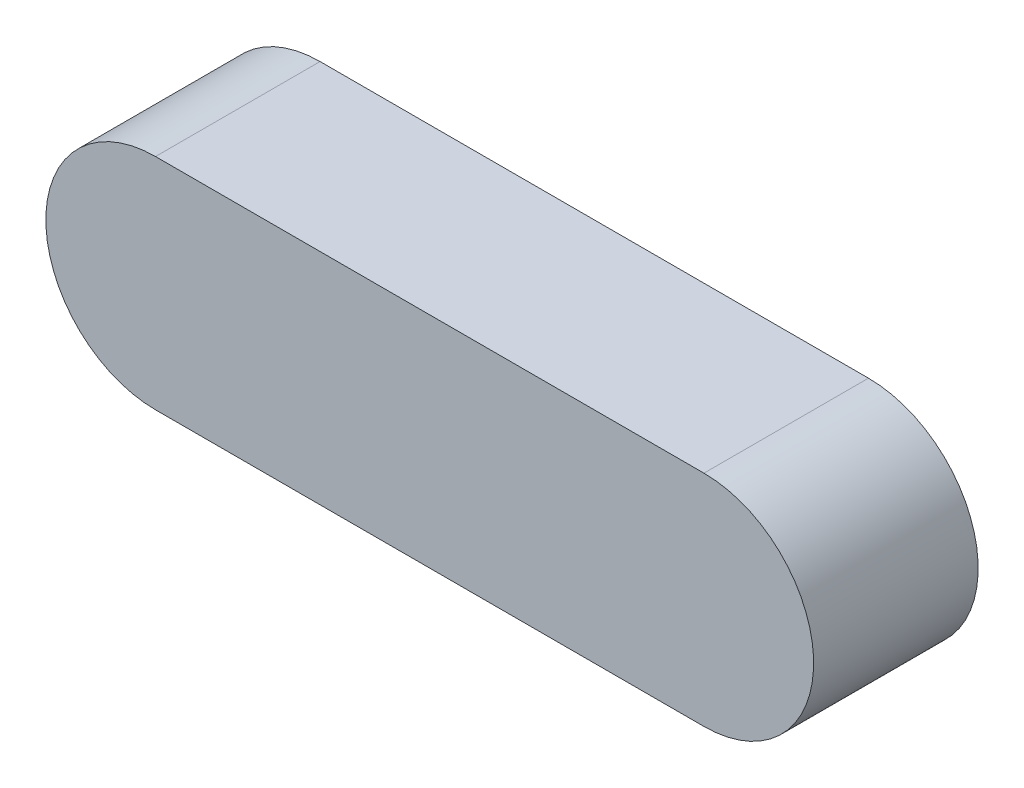
ISO-10303-21;
HEADER;
FILE_DESCRIPTION(('STEP AP214'),'2;1');
FILE_NAME('part.step','',(''),(''),'','','');
FILE_SCHEMA(('AUTOMOTIVE_DESIGN { 1 0 10303 214 1 1 1 1 }'));
ENDSEC;
DATA;
#1=APPLICATION_CONTEXT('core data for automotive mechanical design processes');
#2=APPLICATION_PROTOCOL_DEFINITION('international standard','automotive_design',2000,#1);
#3=PRODUCT_CONTEXT('',#1,'mechanical');
#4=PRODUCT('Part','Part','',(#3));
#5=PRODUCT_RELATED_PRODUCT_CATEGORY('part','',(#4));
#6=PRODUCT_DEFINITION_FORMATION('','',#4);
#7=PRODUCT_DEFINITION_CONTEXT('part definition',#1,'design');
#8=PRODUCT_DEFINITION('design','',#6,#7);
#9=PRODUCT_DEFINITION_SHAPE('','',#8);
#10=(LENGTH_UNIT() NAMED_UNIT(*) SI_UNIT(.MILLI.,.METRE.));
#11=(NAMED_UNIT(*) PLANE_ANGLE_UNIT() SI_UNIT($,.RADIAN.));
#12=(NAMED_UNIT(*) SI_UNIT($,.STERADIAN.) SOLID_ANGLE_UNIT());
#13=UNCERTAINTY_MEASURE_WITH_UNIT(LENGTH_MEASURE(1.E-05),#10,'distance_accuracy_value','');
#14=(GEOMETRIC_REPRESENTATION_CONTEXT(3) GLOBAL_UNCERTAINTY_ASSIGNED_CONTEXT((#13)) GLOBAL_UNIT_ASSIGNED_CONTEXT((#10,
#11,#12)) REPRESENTATION_CONTEXT('',''));
#15=CARTESIAN_POINT('',(0.,0.,0.));
#16=DIRECTION('',(0.,0.,1.));
#17=DIRECTION('',(1.,0.,0.));
#18=AXIS2_PLACEMENT_3D('',#15,#16,#17);
#19=CARTESIAN_POINT('',(0.,0.,6.));
#20=DIRECTION('',(0.,0.,-1.));
#21=DIRECTION('',(-1.,0.,0.));
#22=AXIS2_PLACEMENT_3D('',#19,#20,#21);
#23=CYLINDRICAL_SURFACE('',#22,4.);
#24=CARTESIAN_POINT('',(0.,0.,0.));
#25=DIRECTION('',(0.,0.,1.));
#26=DIRECTION('',(1.,0.,0.));
#27=AXIS2_PLACEMENT_3D('',#24,#25,#26);
#28=CIRCLE('',#27,4.);
#29=CARTESIAN_POINT('',(0.,4.,0.));
#30=VERTEX_POINT('',#29);
#31=CARTESIAN_POINT('',(0.,-4.,0.));
#32=VERTEX_POINT('',#31);
#33=EDGE_CURVE('E107',#30,#32,#28,.T.);
#34=ORIENTED_EDGE('',*,*,#33,.T.);
#35=DIRECTION('',(0.,0.,-1.));
#36=VECTOR('',#35,1.);
#37=CARTESIAN_POINT('',(0.,-4.,6.));
#38=LINE('',#37,#36);
#39=CARTESIAN_POINT('',(0.,-4.,6.));
#40=VERTEX_POINT('',#39);
#41=EDGE_CURVE('E11',#40,#32,#38,.T.);
#42=ORIENTED_EDGE('',*,*,#41,.F.);
#43=CARTESIAN_POINT('',(0.,0.,6.));
#44=DIRECTION('',(0.,0.,1.));
#45=DIRECTION('',(1.,0.,0.));
#46=AXIS2_PLACEMENT_3D('',#43,#44,#45);
#47=CIRCLE('',#46,4.);
#48=CARTESIAN_POINT('',(0.,4.,6.));
#49=VERTEX_POINT('',#48);
#50=EDGE_CURVE('E91',#49,#40,#47,.T.);
#51=ORIENTED_EDGE('',*,*,#50,.F.);
#52=DIRECTION('',(0.,0.,-1.));
#53=VECTOR('',#52,1.);
#54=CARTESIAN_POINT('',(0.,4.,6.));
#55=LINE('',#54,#53);
#56=EDGE_CURVE('E103',#49,#30,#55,.T.);
#57=ORIENTED_EDGE('',*,*,#56,.T.);
#58=EDGE_LOOP('',(#34,#42,#51,#57));
#59=FACE_BOUND('',#58,.T.);
#60=ADVANCED_FACE('F39',(#59),#23,.T.);
#61=CARTESIAN_POINT('',(0.,-4.,6.));
#62=DIRECTION('',(0.,1.,0.));
#63=DIRECTION('',(0.,0.,1.));
#64=AXIS2_PLACEMENT_3D('',#61,#62,#63);
#65=PLANE('',#64);
#66=DIRECTION('',(1.,0.,0.));
#67=VECTOR('',#66,1.);
#68=CARTESIAN_POINT('',(0.,-4.,0.));
#69=LINE('',#68,#67);
#70=CARTESIAN_POINT('',(20.,-4.,0.));
#71=VERTEX_POINT('',#70);
#72=EDGE_CURVE('E96',#32,#71,#69,.T.);
#73=ORIENTED_EDGE('',*,*,#72,.T.);
#74=DIRECTION('',(0.,0.,-1.));
#75=VECTOR('',#74,1.);
#76=CARTESIAN_POINT('',(20.,-4.,6.));
#77=LINE('',#76,#75);
#78=CARTESIAN_POINT('',(20.,-4.,6.));
#79=VERTEX_POINT('',#78);
#80=EDGE_CURVE('E48',#79,#71,#77,.T.);
#81=ORIENTED_EDGE('',*,*,#80,.F.);
#82=DIRECTION('',(1.,0.,0.));
#83=VECTOR('',#82,1.);
#84=CARTESIAN_POINT('',(0.,-4.,6.));
#85=LINE('',#84,#83);
#86=EDGE_CURVE('E86',#40,#79,#85,.T.);
#87=ORIENTED_EDGE('',*,*,#86,.F.);
#88=ORIENTED_EDGE('',*,*,#41,.T.);
#89=EDGE_LOOP('',(#73,#81,#87,#88));
#90=FACE_BOUND('',#89,.T.);
#91=ADVANCED_FACE('F95',(#90),#65,.F.);
#92=CARTESIAN_POINT('',(20.,0.,6.));
#93=DIRECTION('',(0.,0.,-1.));
#94=DIRECTION('',(-1.,0.,0.));
#95=AXIS2_PLACEMENT_3D('',#92,#93,#94);
#96=CYLINDRICAL_SURFACE('',#95,4.);
#97=CARTESIAN_POINT('',(20.,0.,0.));
#98=DIRECTION('',(0.,0.,1.));
#99=DIRECTION('',(1.,0.,0.));
#100=AXIS2_PLACEMENT_3D('',#97,#98,#99);
#101=CIRCLE('',#100,4.);
#102=CARTESIAN_POINT('',(20.,4.,0.));
#103=VERTEX_POINT('',#102);
#104=EDGE_CURVE('E73',#71,#103,#101,.T.);
#105=ORIENTED_EDGE('',*,*,#104,.T.);
#106=DIRECTION('',(0.,0.,-1.));
#107=VECTOR('',#106,1.);
#108=CARTESIAN_POINT('',(20.,4.,6.));
#109=LINE('',#108,#107);
#110=CARTESIAN_POINT('',(20.,4.,6.));
#111=VERTEX_POINT('',#110);
#112=EDGE_CURVE('E98',#111,#103,#109,.T.);
#113=ORIENTED_EDGE('',*,*,#112,.F.);
#114=CARTESIAN_POINT('',(20.,0.,6.));
#115=DIRECTION('',(0.,0.,1.));
#116=DIRECTION('',(1.,0.,0.));
#117=AXIS2_PLACEMENT_3D('',#114,#115,#116);
#118=CIRCLE('',#117,4.);
#119=EDGE_CURVE('E89',#79,#111,#118,.T.);
#120=ORIENTED_EDGE('',*,*,#119,.F.);
#121=ORIENTED_EDGE('',*,*,#80,.T.);
#122=EDGE_LOOP('',(#105,#113,#120,#121));
#123=FACE_BOUND('',#122,.T.);
#124=ADVANCED_FACE('F99',(#123),#96,.T.);
#125=CARTESIAN_POINT('',(0.,4.,6.));
#126=DIRECTION('',(0.,-1.,0.));
#127=DIRECTION('',(0.,0.,-1.));
#128=AXIS2_PLACEMENT_3D('',#125,#126,#127);
#129=PLANE('',#128);
#130=DIRECTION('',(-1.,0.,0.));
#131=VECTOR('',#130,1.);
#132=CARTESIAN_POINT('',(0.,4.,0.));
#133=LINE('',#132,#131);
#134=EDGE_CURVE('E79',#103,#30,#133,.T.);
#135=ORIENTED_EDGE('',*,*,#134,.T.);
#136=ORIENTED_EDGE('',*,*,#56,.F.);
#137=DIRECTION('',(-1.,0.,0.));
#138=VECTOR('',#137,1.);
#139=CARTESIAN_POINT('',(0.,4.,6.));
#140=LINE('',#139,#138);
#141=EDGE_CURVE('E56',#111,#49,#140,.T.);
#142=ORIENTED_EDGE('',*,*,#141,.F.);
#143=ORIENTED_EDGE('',*,*,#112,.T.);
#144=EDGE_LOOP('',(#135,#136,#142,#143));
#145=FACE_BOUND('',#144,.T.);
#146=ADVANCED_FACE('F120',(#145),#129,.F.);
#147=CARTESIAN_POINT('',(0.,0.,6.));
#148=DIRECTION('',(0.,0.,1.));
#149=DIRECTION('',(1.,0.,0.));
#150=AXIS2_PLACEMENT_3D('',#147,#148,#149);
#151=PLANE('',#150);
#152=ORIENTED_EDGE('',*,*,#50,.T.);
#153=ORIENTED_EDGE('',*,*,#86,.T.);
#154=ORIENTED_EDGE('',*,*,#119,.T.);
#155=ORIENTED_EDGE('',*,*,#141,.T.);
#156=EDGE_LOOP('',(#152,#153,#154,#155));
#157=FACE_BOUND('',#156,.T.);
#158=ADVANCED_FACE('F87',(#157),#151,.T.);
#159=CARTESIAN_POINT('',(0.,0.,0.));
#160=DIRECTION('',(0.,0.,1.));
#161=DIRECTION('',(1.,0.,0.));
#162=AXIS2_PLACEMENT_3D('',#159,#160,#161);
#163=PLANE('',#162);
#164=ORIENTED_EDGE('',*,*,#33,.F.);
#165=ORIENTED_EDGE('',*,*,#134,.F.);
#166=ORIENTED_EDGE('',*,*,#104,.F.);
#167=ORIENTED_EDGE('',*,*,#72,.F.);
#168=EDGE_LOOP('',(#164,#165,#166,#167));
#169=FACE_BOUND('',#168,.T.);
#170=ADVANCED_FACE('F123',(#169),#163,.F.);
#171=CLOSED_SHELL('',(#60,#91,#124,#146,#158,#170));
#172=MANIFOLD_SOLID_BREP('B2',#171);
#173=ADVANCED_BREP_SHAPE_REPRESENTATION('',(#18,#172),#14);
#174=SHAPE_DEFINITION_REPRESENTATION(#9,#173);
ENDSEC;
END-ISO-10303-21;
